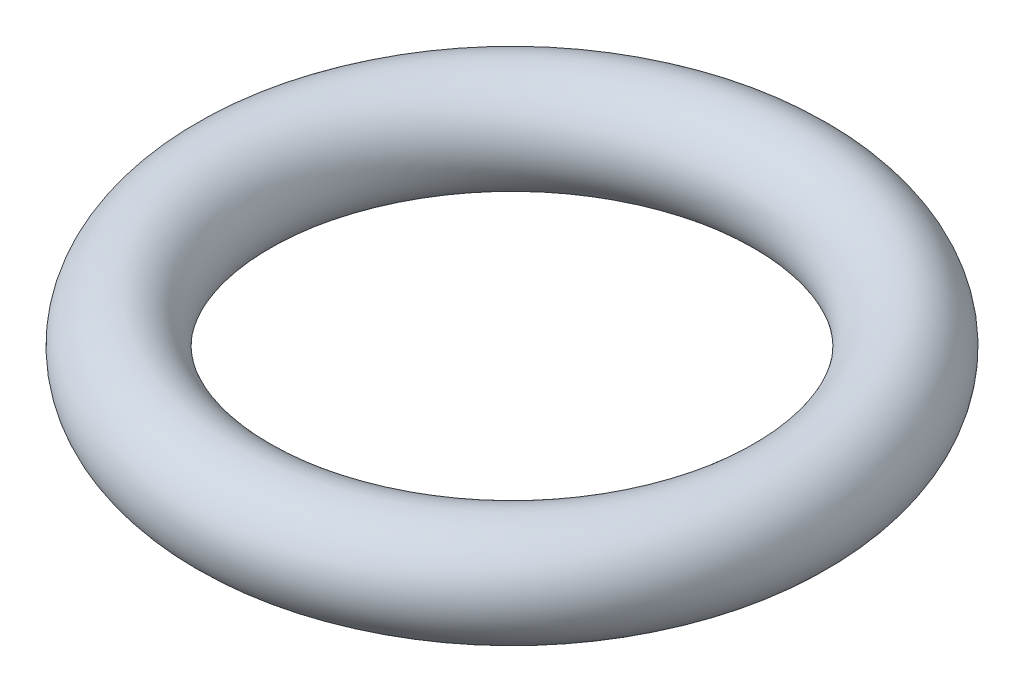
ISO-10303-21;
HEADER;
FILE_DESCRIPTION(('STEP AP214'),'2;1');
FILE_NAME('part.step','',(''),(''),'','','');
FILE_SCHEMA(('AUTOMOTIVE_DESIGN { 1 0 10303 214 1 1 1 1 }'));
ENDSEC;
DATA;
#1=APPLICATION_CONTEXT('core data for automotive mechanical design processes');
#2=APPLICATION_PROTOCOL_DEFINITION('international standard','automotive_design',2000,#1);
#3=PRODUCT_CONTEXT('',#1,'mechanical');
#4=PRODUCT('Part','Part','',(#3));
#5=PRODUCT_RELATED_PRODUCT_CATEGORY('part','',(#4));
#6=PRODUCT_DEFINITION_FORMATION('','',#4);
#7=PRODUCT_DEFINITION_CONTEXT('part definition',#1,'design');
#8=PRODUCT_DEFINITION('design','',#6,#7);
#9=PRODUCT_DEFINITION_SHAPE('','',#8);
#10=(LENGTH_UNIT() NAMED_UNIT(*) SI_UNIT(.MILLI.,.METRE.));
#11=(NAMED_UNIT(*) PLANE_ANGLE_UNIT() SI_UNIT($,.RADIAN.));
#12=(NAMED_UNIT(*) SI_UNIT($,.STERADIAN.) SOLID_ANGLE_UNIT());
#13=UNCERTAINTY_MEASURE_WITH_UNIT(LENGTH_MEASURE(1.E-05),#10,'distance_accuracy_value','');
#14=(GEOMETRIC_REPRESENTATION_CONTEXT(3) GLOBAL_UNCERTAINTY_ASSIGNED_CONTEXT((#13)) GLOBAL_UNIT_ASSIGNED_CONTEXT((#10,
#11,#12)) REPRESENTATION_CONTEXT('',''));
#15=CARTESIAN_POINT('',(0.,0.,0.));
#16=DIRECTION('',(0.,0.,1.));
#17=DIRECTION('',(1.,0.,0.));
#18=AXIS2_PLACEMENT_3D('',#15,#16,#17);
#19=CARTESIAN_POINT('',(0.,0.,0.));
#20=DIRECTION('',(0.,-1.,0.));
#21=DIRECTION('',(0.,0.,-1.));
#22=AXIS2_PLACEMENT_3D('',#19,#20,#21);
#23=TOROIDAL_SURFACE('',#22,4.69,0.865);
#24=CARTESIAN_POINT('',(0.,0.,-5.555));
#25=VERTEX_POINT('',#24);
#26=VERTEX_LOOP('',#25);
#27=FACE_BOUND('',#26,.T.);
#28=ADVANCED_FACE('F29',(#27),#23,.T.);
#29=CLOSED_SHELL('',(#28));
#30=MANIFOLD_SOLID_BREP('B2',#29);
#31=ADVANCED_BREP_SHAPE_REPRESENTATION('',(#18,#30),#14);
#32=SHAPE_DEFINITION_REPRESENTATION(#9,#31);
ENDSEC;
END-ISO-10303-21;
